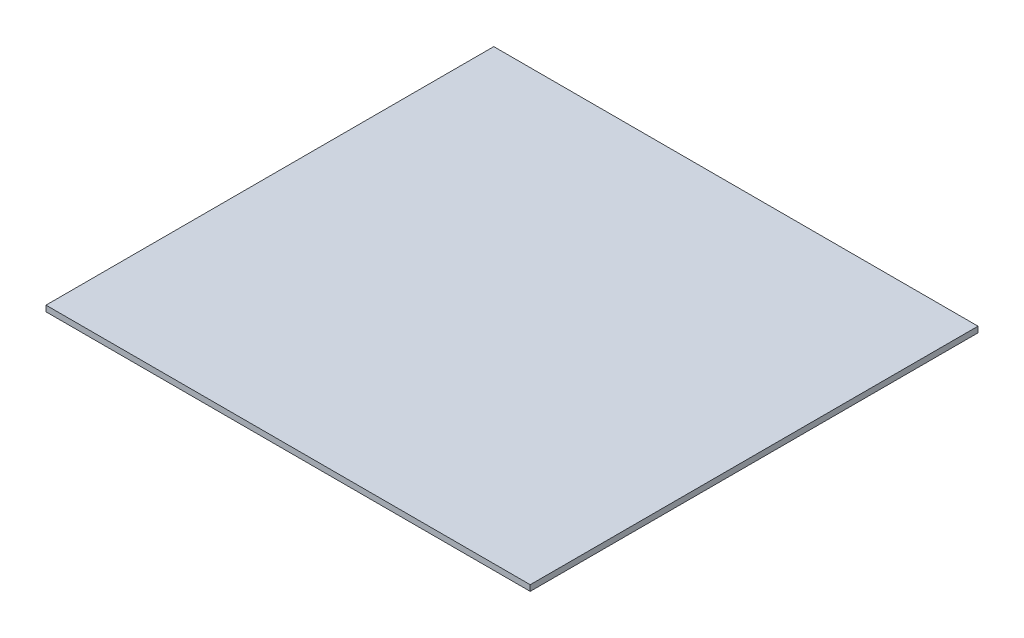
ISO-10303-21;
HEADER;
FILE_DESCRIPTION(('STEP AP214'),'2;1');
FILE_NAME('part.step','',(''),(''),'','','');
FILE_SCHEMA(('AUTOMOTIVE_DESIGN { 1 0 10303 214 1 1 1 1 }'));
ENDSEC;
DATA;
#1=APPLICATION_CONTEXT('core data for automotive mechanical design processes');
#2=APPLICATION_PROTOCOL_DEFINITION('international standard','automotive_design',2000,#1);
#3=PRODUCT_CONTEXT('',#1,'mechanical');
#4=PRODUCT('Part','Part','',(#3));
#5=PRODUCT_RELATED_PRODUCT_CATEGORY('part','',(#4));
#6=PRODUCT_DEFINITION_FORMATION('','',#4);
#7=PRODUCT_DEFINITION_CONTEXT('part definition',#1,'design');
#8=PRODUCT_DEFINITION('design','',#6,#7);
#9=PRODUCT_DEFINITION_SHAPE('','',#8);
#10=(LENGTH_UNIT() NAMED_UNIT(*) SI_UNIT(.MILLI.,.METRE.));
#11=(NAMED_UNIT(*) PLANE_ANGLE_UNIT() SI_UNIT($,.RADIAN.));
#12=(NAMED_UNIT(*) SI_UNIT($,.STERADIAN.) SOLID_ANGLE_UNIT());
#13=UNCERTAINTY_MEASURE_WITH_UNIT(LENGTH_MEASURE(1.E-05),#10,'distance_accuracy_value','');
#14=(GEOMETRIC_REPRESENTATION_CONTEXT(3) GLOBAL_UNCERTAINTY_ASSIGNED_CONTEXT((#13)) GLOBAL_UNIT_ASSIGNED_CONTEXT((#10,
#11,#12)) REPRESENTATION_CONTEXT('',''));
#15=CARTESIAN_POINT('',(0.,0.,0.));
#16=DIRECTION('',(0.,0.,1.));
#17=DIRECTION('',(1.,0.,0.));
#18=AXIS2_PLACEMENT_3D('',#15,#16,#17);
#19=CARTESIAN_POINT('',(62.45,1.5,-57.75));
#20=DIRECTION('',(-1.,0.,0.));
#21=DIRECTION('',(0.,0.,1.));
#22=AXIS2_PLACEMENT_3D('',#19,#20,#21);
#23=PLANE('',#22);
#24=DIRECTION('',(0.,0.,-1.));
#25=VECTOR('',#24,1.);
#26=CARTESIAN_POINT('',(62.45,0.,-57.75));
#27=LINE('',#26,#25);
#28=CARTESIAN_POINT('',(62.45,0.,57.75));
#29=VERTEX_POINT('',#28);
#30=CARTESIAN_POINT('',(62.45,0.,-57.75));
#31=VERTEX_POINT('',#30);
#32=EDGE_CURVE('E107',#29,#31,#27,.T.);
#33=ORIENTED_EDGE('',*,*,#32,.T.);
#34=DIRECTION('',(0.,-1.,0.));
#35=VECTOR('',#34,1.);
#36=CARTESIAN_POINT('',(62.45,1.5,-57.75));
#37=LINE('',#36,#35);
#38=CARTESIAN_POINT('',(62.45,1.5,-57.75));
#39=VERTEX_POINT('',#38);
#40=EDGE_CURVE('E11',#39,#31,#37,.T.);
#41=ORIENTED_EDGE('',*,*,#40,.F.);
#42=DIRECTION('',(0.,0.,-1.));
#43=VECTOR('',#42,1.);
#44=CARTESIAN_POINT('',(62.45,1.5,-57.75));
#45=LINE('',#44,#43);
#46=CARTESIAN_POINT('',(62.45,1.5,57.75));
#47=VERTEX_POINT('',#46);
#48=EDGE_CURVE('E91',#47,#39,#45,.T.);
#49=ORIENTED_EDGE('',*,*,#48,.F.);
#50=DIRECTION('',(0.,-1.,0.));
#51=VECTOR('',#50,1.);
#52=CARTESIAN_POINT('',(62.45,1.5,57.75));
#53=LINE('',#52,#51);
#54=EDGE_CURVE('E103',#47,#29,#53,.T.);
#55=ORIENTED_EDGE('',*,*,#54,.T.);
#56=EDGE_LOOP('',(#33,#41,#49,#55));
#57=FACE_BOUND('',#56,.T.);
#58=ADVANCED_FACE('F39',(#57),#23,.F.);
#59=CARTESIAN_POINT('',(-62.45,1.5,-57.75));
#60=DIRECTION('',(0.,0.,1.));
#61=DIRECTION('',(1.,0.,0.));
#62=AXIS2_PLACEMENT_3D('',#59,#60,#61);
#63=PLANE('',#62);
#64=DIRECTION('',(-1.,0.,0.));
#65=VECTOR('',#64,1.);
#66=CARTESIAN_POINT('',(-62.45,0.,-57.75));
#67=LINE('',#66,#65);
#68=CARTESIAN_POINT('',(-62.45,0.,-57.75));
#69=VERTEX_POINT('',#68);
#70=EDGE_CURVE('E96',#31,#69,#67,.T.);
#71=ORIENTED_EDGE('',*,*,#70,.T.);
#72=DIRECTION('',(0.,-1.,0.));
#73=VECTOR('',#72,1.);
#74=CARTESIAN_POINT('',(-62.45,1.5,-57.75));
#75=LINE('',#74,#73);
#76=CARTESIAN_POINT('',(-62.45,1.5,-57.75));
#77=VERTEX_POINT('',#76);
#78=EDGE_CURVE('E48',#77,#69,#75,.T.);
#79=ORIENTED_EDGE('',*,*,#78,.F.);
#80=DIRECTION('',(-1.,0.,0.));
#81=VECTOR('',#80,1.);
#82=CARTESIAN_POINT('',(-62.45,1.5,-57.75));
#83=LINE('',#82,#81);
#84=EDGE_CURVE('E86',#39,#77,#83,.T.);
#85=ORIENTED_EDGE('',*,*,#84,.F.);
#86=ORIENTED_EDGE('',*,*,#40,.T.);
#87=EDGE_LOOP('',(#71,#79,#85,#86));
#88=FACE_BOUND('',#87,.T.);
#89=ADVANCED_FACE('F95',(#88),#63,.F.);
#90=CARTESIAN_POINT('',(-62.45,1.5,-57.75));
#91=DIRECTION('',(1.,0.,0.));
#92=DIRECTION('',(0.,0.,-1.));
#93=AXIS2_PLACEMENT_3D('',#90,#91,#92);
#94=PLANE('',#93);
#95=DIRECTION('',(0.,0.,1.));
#96=VECTOR('',#95,1.);
#97=CARTESIAN_POINT('',(-62.45,0.,-57.75));
#98=LINE('',#97,#96);
#99=CARTESIAN_POINT('',(-62.45,0.,57.75));
#100=VERTEX_POINT('',#99);
#101=EDGE_CURVE('E73',#69,#100,#98,.T.);
#102=ORIENTED_EDGE('',*,*,#101,.T.);
#103=DIRECTION('',(0.,-1.,0.));
#104=VECTOR('',#103,1.);
#105=CARTESIAN_POINT('',(-62.45,1.5,57.75));
#106=LINE('',#105,#104);
#107=CARTESIAN_POINT('',(-62.45,1.5,57.75));
#108=VERTEX_POINT('',#107);
#109=EDGE_CURVE('E98',#108,#100,#106,.T.);
#110=ORIENTED_EDGE('',*,*,#109,.F.);
#111=DIRECTION('',(0.,0.,1.));
#112=VECTOR('',#111,1.);
#113=CARTESIAN_POINT('',(-62.45,1.5,-57.75));
#114=LINE('',#113,#112);
#115=EDGE_CURVE('E89',#77,#108,#114,.T.);
#116=ORIENTED_EDGE('',*,*,#115,.F.);
#117=ORIENTED_EDGE('',*,*,#78,.T.);
#118=EDGE_LOOP('',(#102,#110,#116,#117));
#119=FACE_BOUND('',#118,.T.);
#120=ADVANCED_FACE('F99',(#119),#94,.F.);
#121=CARTESIAN_POINT('',(-62.45,1.5,57.75));
#122=DIRECTION('',(0.,0.,-1.));
#123=DIRECTION('',(-1.,0.,0.));
#124=AXIS2_PLACEMENT_3D('',#121,#122,#123);
#125=PLANE('',#124);
#126=DIRECTION('',(1.,0.,0.));
#127=VECTOR('',#126,1.);
#128=CARTESIAN_POINT('',(-62.45,0.,57.75));
#129=LINE('',#128,#127);
#130=EDGE_CURVE('E79',#100,#29,#129,.T.);
#131=ORIENTED_EDGE('',*,*,#130,.T.);
#132=ORIENTED_EDGE('',*,*,#54,.F.);
#133=DIRECTION('',(1.,0.,0.));
#134=VECTOR('',#133,1.);
#135=CARTESIAN_POINT('',(-62.45,1.5,57.75));
#136=LINE('',#135,#134);
#137=EDGE_CURVE('E56',#108,#47,#136,.T.);
#138=ORIENTED_EDGE('',*,*,#137,.F.);
#139=ORIENTED_EDGE('',*,*,#109,.T.);
#140=EDGE_LOOP('',(#131,#132,#138,#139));
#141=FACE_BOUND('',#140,.T.);
#142=ADVANCED_FACE('F120',(#141),#125,.F.);
#143=CARTESIAN_POINT('',(0.,1.5,0.));
#144=DIRECTION('',(0.,1.,0.));
#145=DIRECTION('',(0.,0.,1.));
#146=AXIS2_PLACEMENT_3D('',#143,#144,#145);
#147=PLANE('',#146);
#148=ORIENTED_EDGE('',*,*,#48,.T.);
#149=ORIENTED_EDGE('',*,*,#84,.T.);
#150=ORIENTED_EDGE('',*,*,#115,.T.);
#151=ORIENTED_EDGE('',*,*,#137,.T.);
#152=EDGE_LOOP('',(#148,#149,#150,#151));
#153=FACE_BOUND('',#152,.T.);
#154=ADVANCED_FACE('F87',(#153),#147,.T.);
#155=CARTESIAN_POINT('',(0.,0.,0.));
#156=DIRECTION('',(0.,1.,0.));
#157=DIRECTION('',(0.,0.,1.));
#158=AXIS2_PLACEMENT_3D('',#155,#156,#157);
#159=PLANE('',#158);
#160=ORIENTED_EDGE('',*,*,#32,.F.);
#161=ORIENTED_EDGE('',*,*,#130,.F.);
#162=ORIENTED_EDGE('',*,*,#101,.F.);
#163=ORIENTED_EDGE('',*,*,#70,.F.);
#164=EDGE_LOOP('',(#160,#161,#162,#163));
#165=FACE_BOUND('',#164,.T.);
#166=ADVANCED_FACE('F123',(#165),#159,.F.);
#167=CLOSED_SHELL('',(#58,#89,#120,#142,#154,#166));
#168=MANIFOLD_SOLID_BREP('B2',#167);
#169=ADVANCED_BREP_SHAPE_REPRESENTATION('',(#18,#168),#14);
#170=SHAPE_DEFINITION_REPRESENTATION(#9,#169);
ENDSEC;
END-ISO-10303-21;
